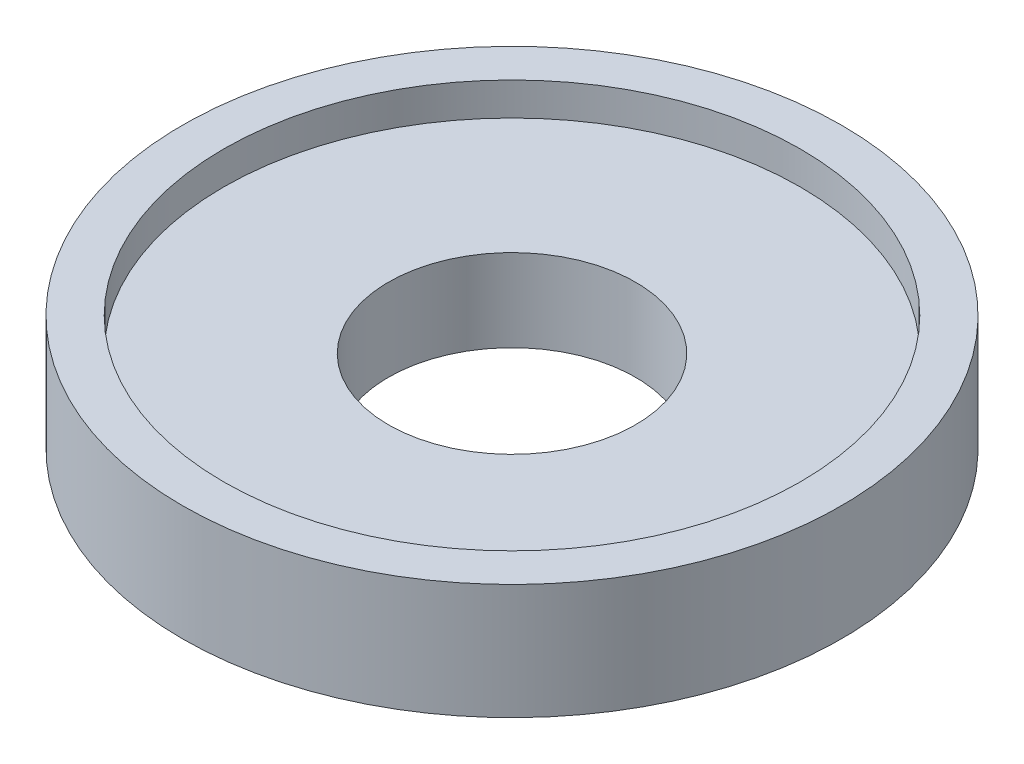
ISO-10303-21;
HEADER;
FILE_DESCRIPTION(('STEP AP214'),'2;1');
FILE_NAME('part.step','',(''),(''),'','','');
FILE_SCHEMA(('AUTOMOTIVE_DESIGN { 1 0 10303 214 1 1 1 1 }'));
ENDSEC;
DATA;
#1=APPLICATION_CONTEXT('core data for automotive mechanical design processes');
#2=APPLICATION_PROTOCOL_DEFINITION('international standard','automotive_design',2000,#1);
#3=PRODUCT_CONTEXT('',#1,'mechanical');
#4=PRODUCT('Part','Part','',(#3));
#5=PRODUCT_RELATED_PRODUCT_CATEGORY('part','',(#4));
#6=PRODUCT_DEFINITION_FORMATION('','',#4);
#7=PRODUCT_DEFINITION_CONTEXT('part definition',#1,'design');
#8=PRODUCT_DEFINITION('design','',#6,#7);
#9=PRODUCT_DEFINITION_SHAPE('','',#8);
#10=(LENGTH_UNIT() NAMED_UNIT(*) SI_UNIT(.MILLI.,.METRE.));
#11=(NAMED_UNIT(*) PLANE_ANGLE_UNIT() SI_UNIT($,.RADIAN.));
#12=(NAMED_UNIT(*) SI_UNIT($,.STERADIAN.) SOLID_ANGLE_UNIT());
#13=UNCERTAINTY_MEASURE_WITH_UNIT(LENGTH_MEASURE(1.E-05),#10,'distance_accuracy_value','');
#14=(GEOMETRIC_REPRESENTATION_CONTEXT(3) GLOBAL_UNCERTAINTY_ASSIGNED_CONTEXT((#13)) GLOBAL_UNIT_ASSIGNED_CONTEXT((#10,
#11,#12)) REPRESENTATION_CONTEXT('',''));
#15=CARTESIAN_POINT('',(0.,0.,0.));
#16=DIRECTION('',(0.,0.,1.));
#17=DIRECTION('',(1.,0.,0.));
#18=AXIS2_PLACEMENT_3D('',#15,#16,#17);
#19=CARTESIAN_POINT('',(0.,5.,0.));
#20=DIRECTION('',(0.,-1.,0.));
#21=DIRECTION('',(0.,0.,-1.));
#22=AXIS2_PLACEMENT_3D('',#19,#20,#21);
#23=CYLINDRICAL_SURFACE('',#22,20.);
#24=CARTESIAN_POINT('',(0.,0.,0.));
#25=DIRECTION('',(0.,1.,0.));
#26=DIRECTION('',(0.,0.,1.));
#27=AXIS2_PLACEMENT_3D('',#24,#25,#26);
#28=CIRCLE('',#27,20.);
#29=CARTESIAN_POINT('',(0.,0.,20.));
#30=VERTEX_POINT('',#29);
#31=EDGE_CURVE('E42',#30,#30,#28,.T.);
#32=ORIENTED_EDGE('',*,*,#31,.T.);
#33=EDGE_LOOP('',(#32));
#34=FACE_BOUND('',#33,.T.);
#35=CARTESIAN_POINT('',(0.,7.,0.));
#36=DIRECTION('',(0.,1.,0.));
#37=DIRECTION('',(0.,0.,1.));
#38=AXIS2_PLACEMENT_3D('',#35,#36,#37);
#39=CIRCLE('',#38,20.);
#40=CARTESIAN_POINT('',(0.,7.,20.));
#41=VERTEX_POINT('',#40);
#42=EDGE_CURVE('E47',#41,#41,#39,.T.);
#43=ORIENTED_EDGE('',*,*,#42,.F.);
#44=EDGE_LOOP('',(#43));
#45=FACE_BOUND('',#44,.T.);
#46=ADVANCED_FACE('F35',(#34,#45),#23,.T.);
#47=CARTESIAN_POINT('',(0.,0.,0.));
#48=DIRECTION('',(0.,1.,0.));
#49=DIRECTION('',(0.,0.,1.));
#50=AXIS2_PLACEMENT_3D('',#47,#48,#49);
#51=PLANE('',#50);
#52=CARTESIAN_POINT('',(0.,0.,0.));
#53=DIRECTION('',(0.,1.,0.));
#54=DIRECTION('',(0.,0.,1.));
#55=AXIS2_PLACEMENT_3D('',#52,#53,#54);
#56=CIRCLE('',#55,7.5);
#57=CARTESIAN_POINT('',(0.,0.,7.5));
#58=VERTEX_POINT('',#57);
#59=EDGE_CURVE('E38',#58,#58,#56,.T.);
#60=ORIENTED_EDGE('',*,*,#59,.T.);
#61=EDGE_LOOP('',(#60));
#62=FACE_BOUND('',#61,.T.);
#63=ORIENTED_EDGE('',*,*,#31,.F.);
#64=EDGE_LOOP('',(#63));
#65=FACE_BOUND('',#64,.T.);
#66=ADVANCED_FACE('F61',(#62,#65),#51,.F.);
#67=CARTESIAN_POINT('',(0.,7.,0.));
#68=DIRECTION('',(0.,1.,0.));
#69=DIRECTION('',(0.,0.,1.));
#70=AXIS2_PLACEMENT_3D('',#67,#68,#69);
#71=PLANE('',#70);
#72=ORIENTED_EDGE('',*,*,#42,.T.);
#73=EDGE_LOOP('',(#72));
#74=FACE_BOUND('',#73,.T.);
#75=CARTESIAN_POINT('',(0.,7.,0.));
#76=DIRECTION('',(0.,1.,0.));
#77=DIRECTION('',(0.,0.,1.));
#78=AXIS2_PLACEMENT_3D('',#75,#76,#77);
#79=CIRCLE('',#78,17.5);
#80=CARTESIAN_POINT('',(0.,7.,17.5));
#81=VERTEX_POINT('',#80);
#82=EDGE_CURVE('E51',#81,#81,#79,.T.);
#83=ORIENTED_EDGE('',*,*,#82,.F.);
#84=EDGE_LOOP('',(#83));
#85=FACE_BOUND('',#84,.T.);
#86=ADVANCED_FACE('F80',(#74,#85),#71,.T.);
#87=CARTESIAN_POINT('',(0.,7.,0.));
#88=DIRECTION('',(0.,-1.,0.));
#89=DIRECTION('',(0.,0.,-1.));
#90=AXIS2_PLACEMENT_3D('',#87,#88,#89);
#91=CYLINDRICAL_SURFACE('',#90,17.5);
#92=CARTESIAN_POINT('',(0.,5.,0.));
#93=DIRECTION('',(0.,1.,0.));
#94=DIRECTION('',(0.,0.,1.));
#95=AXIS2_PLACEMENT_3D('',#92,#93,#94);
#96=CIRCLE('',#95,17.5);
#97=CARTESIAN_POINT('',(0.,5.,17.5));
#98=VERTEX_POINT('',#97);
#99=EDGE_CURVE('E10',#98,#98,#96,.F.);
#100=ORIENTED_EDGE('',*,*,#99,.T.);
#101=EDGE_LOOP('',(#100));
#102=FACE_BOUND('',#101,.T.);
#103=ORIENTED_EDGE('',*,*,#82,.T.);
#104=EDGE_LOOP('',(#103));
#105=FACE_BOUND('',#104,.T.);
#106=ADVANCED_FACE('F71',(#102,#105),#91,.F.);
#107=CARTESIAN_POINT('',(0.,5.,0.));
#108=DIRECTION('',(0.,1.,0.));
#109=DIRECTION('',(0.,0.,1.));
#110=AXIS2_PLACEMENT_3D('',#107,#108,#109);
#111=PLANE('',#110);
#112=CARTESIAN_POINT('',(0.,5.,0.));
#113=DIRECTION('',(0.,1.,0.));
#114=DIRECTION('',(0.,0.,1.));
#115=AXIS2_PLACEMENT_3D('',#112,#113,#114);
#116=CIRCLE('',#115,7.5);
#117=CARTESIAN_POINT('',(0.,5.,7.5));
#118=VERTEX_POINT('',#117);
#119=EDGE_CURVE('E54',#118,#118,#116,.T.);
#120=ORIENTED_EDGE('',*,*,#119,.F.);
#121=EDGE_LOOP('',(#120));
#122=FACE_BOUND('',#121,.T.);
#123=ORIENTED_EDGE('',*,*,#99,.F.);
#124=EDGE_LOOP('',(#123));
#125=FACE_BOUND('',#124,.T.);
#126=ADVANCED_FACE('F66',(#122,#125),#111,.T.);
#127=CARTESIAN_POINT('',(0.,-2.,0.));
#128=DIRECTION('',(0.,1.,0.));
#129=DIRECTION('',(0.,0.,1.));
#130=AXIS2_PLACEMENT_3D('',#127,#128,#129);
#131=CYLINDRICAL_SURFACE('',#130,7.5);
#132=ORIENTED_EDGE('',*,*,#119,.T.);
#133=EDGE_LOOP('',(#132));
#134=FACE_BOUND('',#133,.T.);
#135=ORIENTED_EDGE('',*,*,#59,.F.);
#136=EDGE_LOOP('',(#135));
#137=FACE_BOUND('',#136,.T.);
#138=ADVANCED_FACE('F64',(#134,#137),#131,.F.);
#139=CLOSED_SHELL('',(#46,#66,#86,#106,#126,#138));
#140=MANIFOLD_SOLID_BREP('B2',#139);
#141=ADVANCED_BREP_SHAPE_REPRESENTATION('',(#18,#140),#14);
#142=SHAPE_DEFINITION_REPRESENTATION(#9,#141);
ENDSEC;
END-ISO-10303-21;
